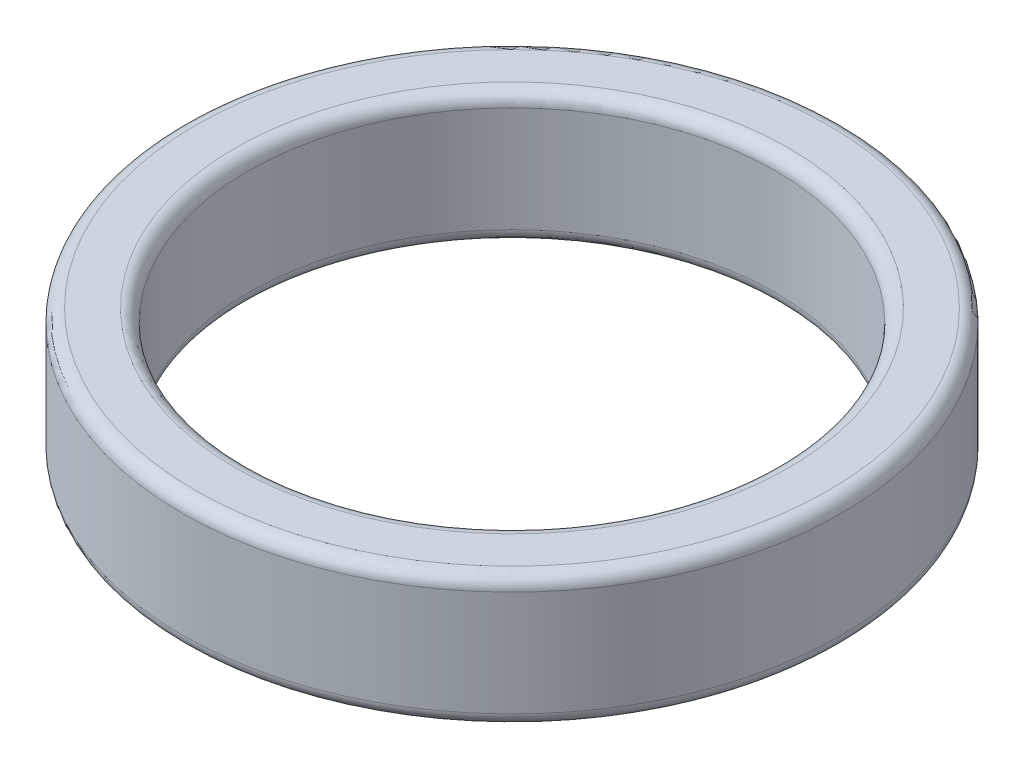
ISO-10303-21;
HEADER;
FILE_DESCRIPTION(('STEP AP214'),'2;1');
FILE_NAME('part.step','',(''),(''),'','','');
FILE_SCHEMA(('AUTOMOTIVE_DESIGN { 1 0 10303 214 1 1 1 1 }'));
ENDSEC;
DATA;
#1=APPLICATION_CONTEXT('core data for automotive mechanical design processes');
#2=APPLICATION_PROTOCOL_DEFINITION('international standard','automotive_design',2000,#1);
#3=PRODUCT_CONTEXT('',#1,'mechanical');
#4=PRODUCT('Part','Part','',(#3));
#5=PRODUCT_RELATED_PRODUCT_CATEGORY('part','',(#4));
#6=PRODUCT_DEFINITION_FORMATION('','',#4);
#7=PRODUCT_DEFINITION_CONTEXT('part definition',#1,'design');
#8=PRODUCT_DEFINITION('design','',#6,#7);
#9=PRODUCT_DEFINITION_SHAPE('','',#8);
#10=(LENGTH_UNIT() NAMED_UNIT(*) SI_UNIT(.MILLI.,.METRE.));
#11=(NAMED_UNIT(*) PLANE_ANGLE_UNIT() SI_UNIT($,.RADIAN.));
#12=(NAMED_UNIT(*) SI_UNIT($,.STERADIAN.) SOLID_ANGLE_UNIT());
#13=UNCERTAINTY_MEASURE_WITH_UNIT(LENGTH_MEASURE(1.E-05),#10,'distance_accuracy_value','');
#14=(GEOMETRIC_REPRESENTATION_CONTEXT(3) GLOBAL_UNCERTAINTY_ASSIGNED_CONTEXT((#13)) GLOBAL_UNIT_ASSIGNED_CONTEXT((#10,
#11,#12)) REPRESENTATION_CONTEXT('',''));
#15=CARTESIAN_POINT('',(0.,0.,0.));
#16=DIRECTION('',(0.,0.,1.));
#17=DIRECTION('',(1.,0.,0.));
#18=AXIS2_PLACEMENT_3D('',#15,#16,#17);
#19=CARTESIAN_POINT('',(0.,5.,0.));
#20=DIRECTION('',(0.,1.,0.));
#21=DIRECTION('',(0.,0.,1.));
#22=AXIS2_PLACEMENT_3D('',#19,#20,#21);
#23=PLANE('',#22);
#24=CARTESIAN_POINT('',(0.,5.,0.));
#25=DIRECTION('',(0.,1.,0.));
#26=DIRECTION('',(0.,0.,1.));
#27=AXIS2_PLACEMENT_3D('',#24,#25,#26);
#28=CIRCLE('',#27,10.5);
#29=CARTESIAN_POINT('',(0.,5.,10.5));
#30=VERTEX_POINT('',#29);
#31=EDGE_CURVE('E46',#30,#30,#28,.F.);
#32=ORIENTED_EDGE('',*,*,#31,.T.);
#33=EDGE_LOOP('',(#32));
#34=FACE_BOUND('',#33,.T.);
#35=CARTESIAN_POINT('',(0.,5.,0.));
#36=DIRECTION('',(0.,1.,0.));
#37=DIRECTION('',(0.,0.,1.));
#38=AXIS2_PLACEMENT_3D('',#35,#36,#37);
#39=CIRCLE('',#38,12.);
#40=CARTESIAN_POINT('',(0.,5.,12.));
#41=VERTEX_POINT('',#40);
#42=EDGE_CURVE('E50',#41,#41,#39,.T.);
#43=ORIENTED_EDGE('',*,*,#42,.T.);
#44=EDGE_LOOP('',(#43));
#45=FACE_BOUND('',#44,.T.);
#46=ADVANCED_FACE('F35',(#34,#45),#23,.T.);
#47=CARTESIAN_POINT('',(0.,0.,0.));
#48=DIRECTION('',(0.,1.,0.));
#49=DIRECTION('',(0.,0.,1.));
#50=AXIS2_PLACEMENT_3D('',#47,#48,#49);
#51=PLANE('',#50);
#52=CARTESIAN_POINT('',(0.,0.,0.));
#53=DIRECTION('',(0.,1.,0.));
#54=DIRECTION('',(0.,0.,1.));
#55=AXIS2_PLACEMENT_3D('',#52,#53,#54);
#56=CIRCLE('',#55,10.5);
#57=CARTESIAN_POINT('',(0.,0.,10.5));
#58=VERTEX_POINT('',#57);
#59=EDGE_CURVE('E61',#58,#58,#56,.T.);
#60=ORIENTED_EDGE('',*,*,#59,.T.);
#61=EDGE_LOOP('',(#60));
#62=FACE_BOUND('',#61,.T.);
#63=CARTESIAN_POINT('',(0.,0.,0.));
#64=DIRECTION('',(0.,1.,0.));
#65=DIRECTION('',(0.,0.,1.));
#66=AXIS2_PLACEMENT_3D('',#63,#64,#65);
#67=CIRCLE('',#66,12.);
#68=CARTESIAN_POINT('',(0.,0.,12.));
#69=VERTEX_POINT('',#68);
#70=EDGE_CURVE('E64',#69,#69,#67,.F.);
#71=ORIENTED_EDGE('',*,*,#70,.T.);
#72=EDGE_LOOP('',(#71));
#73=FACE_BOUND('',#72,.T.);
#74=ADVANCED_FACE('F68',(#62,#73),#51,.F.);
#75=CARTESIAN_POINT('',(0.,5.,0.));
#76=DIRECTION('',(0.,-1.,0.));
#77=DIRECTION('',(0.,0.,-1.));
#78=AXIS2_PLACEMENT_3D('',#75,#76,#77);
#79=CYLINDRICAL_SURFACE('',#78,12.5);
#80=CARTESIAN_POINT('',(0.,0.5,0.));
#81=DIRECTION('',(0.,1.,0.));
#82=DIRECTION('',(0.,0.,1.));
#83=AXIS2_PLACEMENT_3D('',#80,#81,#82);
#84=CIRCLE('',#83,12.5);
#85=CARTESIAN_POINT('',(0.,0.5,12.5));
#86=VERTEX_POINT('',#85);
#87=EDGE_CURVE('E10',#86,#86,#84,.T.);
#88=ORIENTED_EDGE('',*,*,#87,.T.);
#89=EDGE_LOOP('',(#88));
#90=FACE_BOUND('',#89,.T.);
#91=CARTESIAN_POINT('',(0.,4.5,0.));
#92=DIRECTION('',(0.,1.,0.));
#93=DIRECTION('',(0.,0.,1.));
#94=AXIS2_PLACEMENT_3D('',#91,#92,#93);
#95=CIRCLE('',#94,12.5);
#96=CARTESIAN_POINT('',(0.,4.5,12.5));
#97=VERTEX_POINT('',#96);
#98=EDGE_CURVE('E42',#97,#97,#95,.F.);
#99=ORIENTED_EDGE('',*,*,#98,.T.);
#100=EDGE_LOOP('',(#99));
#101=FACE_BOUND('',#100,.T.);
#102=ADVANCED_FACE('F88',(#90,#101),#79,.T.);
#103=CARTESIAN_POINT('',(0.,5.,0.));
#104=DIRECTION('',(0.,-1.,0.));
#105=DIRECTION('',(0.,0.,-1.));
#106=AXIS2_PLACEMENT_3D('',#103,#104,#105);
#107=CYLINDRICAL_SURFACE('',#106,10.);
#108=CARTESIAN_POINT('',(0.,0.5,0.));
#109=DIRECTION('',(0.,1.,0.));
#110=DIRECTION('',(0.,0.,1.));
#111=AXIS2_PLACEMENT_3D('',#108,#109,#110);
#112=CIRCLE('',#111,10.);
#113=CARTESIAN_POINT('',(0.,0.5,10.));
#114=VERTEX_POINT('',#113);
#115=EDGE_CURVE('E55',#114,#114,#112,.F.);
#116=ORIENTED_EDGE('',*,*,#115,.T.);
#117=EDGE_LOOP('',(#116));
#118=FACE_BOUND('',#117,.T.);
#119=CARTESIAN_POINT('',(0.,4.5,0.));
#120=DIRECTION('',(0.,1.,0.));
#121=DIRECTION('',(0.,0.,1.));
#122=AXIS2_PLACEMENT_3D('',#119,#120,#121);
#123=CIRCLE('',#122,10.);
#124=CARTESIAN_POINT('',(0.,4.5,10.));
#125=VERTEX_POINT('',#124);
#126=EDGE_CURVE('E58',#125,#125,#123,.T.);
#127=ORIENTED_EDGE('',*,*,#126,.T.);
#128=EDGE_LOOP('',(#127));
#129=FACE_BOUND('',#128,.T.);
#130=ADVANCED_FACE('F93',(#118,#129),#107,.F.);
#131=CARTESIAN_POINT('',(0.,0.5,0.));
#132=DIRECTION('',(0.,1.,0.));
#133=DIRECTION('',(0.,0.,1.));
#134=AXIS2_PLACEMENT_3D('',#131,#132,#133);
#135=TOROIDAL_SURFACE('',#134,10.5,0.5);
#136=ORIENTED_EDGE('',*,*,#115,.F.);
#137=EDGE_LOOP('',(#136));
#138=FACE_BOUND('',#137,.T.);
#139=ORIENTED_EDGE('',*,*,#59,.F.);
#140=EDGE_LOOP('',(#139));
#141=FACE_BOUND('',#140,.T.);
#142=ADVANCED_FACE('F79',(#138,#141),#135,.T.);
#143=CARTESIAN_POINT('',(0.,4.5,0.));
#144=DIRECTION('',(0.,1.,0.));
#145=DIRECTION('',(0.,0.,1.));
#146=AXIS2_PLACEMENT_3D('',#143,#144,#145);
#147=TOROIDAL_SURFACE('',#146,10.5,0.5);
#148=ORIENTED_EDGE('',*,*,#31,.F.);
#149=EDGE_LOOP('',(#148));
#150=FACE_BOUND('',#149,.T.);
#151=ORIENTED_EDGE('',*,*,#126,.F.);
#152=EDGE_LOOP('',(#151));
#153=FACE_BOUND('',#152,.T.);
#154=ADVANCED_FACE('F73',(#150,#153),#147,.T.);
#155=CARTESIAN_POINT('',(0.,0.5,0.));
#156=DIRECTION('',(0.,1.,0.));
#157=DIRECTION('',(0.,0.,1.));
#158=AXIS2_PLACEMENT_3D('',#155,#156,#157);
#159=TOROIDAL_SURFACE('',#158,12.,0.5);
#160=ORIENTED_EDGE('',*,*,#70,.F.);
#161=EDGE_LOOP('',(#160));
#162=FACE_BOUND('',#161,.T.);
#163=ORIENTED_EDGE('',*,*,#87,.F.);
#164=EDGE_LOOP('',(#163));
#165=FACE_BOUND('',#164,.T.);
#166=ADVANCED_FACE('F70',(#162,#165),#159,.T.);
#167=CARTESIAN_POINT('',(0.,4.5,0.));
#168=DIRECTION('',(0.,1.,0.));
#169=DIRECTION('',(0.,0.,1.));
#170=AXIS2_PLACEMENT_3D('',#167,#168,#169);
#171=TOROIDAL_SURFACE('',#170,12.,0.5);
#172=ORIENTED_EDGE('',*,*,#98,.F.);
#173=EDGE_LOOP('',(#172));
#174=FACE_BOUND('',#173,.T.);
#175=ORIENTED_EDGE('',*,*,#42,.F.);
#176=EDGE_LOOP('',(#175));
#177=FACE_BOUND('',#176,.T.);
#178=ADVANCED_FACE('F37',(#174,#177),#171,.T.);
#179=CLOSED_SHELL('',(#46,#74,#102,#130,#142,#154,#166,#178));
#180=MANIFOLD_SOLID_BREP('B2',#179);
#181=ADVANCED_BREP_SHAPE_REPRESENTATION('',(#18,#180),#14);
#182=SHAPE_DEFINITION_REPRESENTATION(#9,#181);
ENDSEC;
END-ISO-10303-21;
